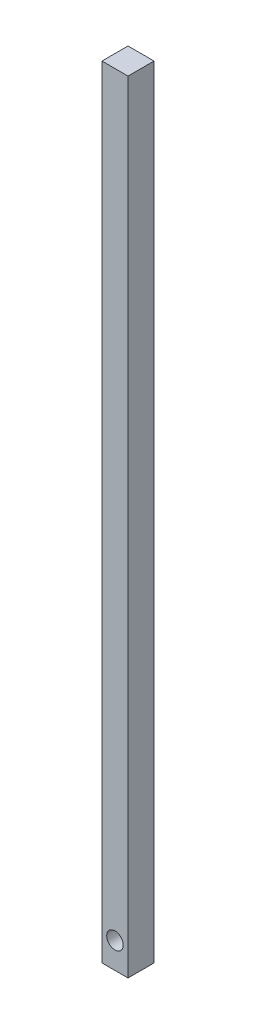
ISO-10303-21;
HEADER;
FILE_DESCRIPTION(('STEP AP214'),'2;1');
FILE_NAME('part.step','',(''),(''),'','','');
FILE_SCHEMA(('AUTOMOTIVE_DESIGN { 1 0 10303 214 1 1 1 1 }'));
ENDSEC;
DATA;
#1=APPLICATION_CONTEXT('core data for automotive mechanical design processes');
#2=APPLICATION_PROTOCOL_DEFINITION('international standard','automotive_design',2000,#1);
#3=PRODUCT_CONTEXT('',#1,'mechanical');
#4=PRODUCT('Part','Part','',(#3));
#5=PRODUCT_RELATED_PRODUCT_CATEGORY('part','',(#4));
#6=PRODUCT_DEFINITION_FORMATION('','',#4);
#7=PRODUCT_DEFINITION_CONTEXT('part definition',#1,'design');
#8=PRODUCT_DEFINITION('design','',#6,#7);
#9=PRODUCT_DEFINITION_SHAPE('','',#8);
#10=(LENGTH_UNIT() NAMED_UNIT(*) SI_UNIT(.MILLI.,.METRE.));
#11=(NAMED_UNIT(*) PLANE_ANGLE_UNIT() SI_UNIT($,.RADIAN.));
#12=(NAMED_UNIT(*) SI_UNIT($,.STERADIAN.) SOLID_ANGLE_UNIT());
#13=UNCERTAINTY_MEASURE_WITH_UNIT(LENGTH_MEASURE(1.E-05),#10,'distance_accuracy_value','');
#14=(GEOMETRIC_REPRESENTATION_CONTEXT(3) GLOBAL_UNCERTAINTY_ASSIGNED_CONTEXT((#13)) GLOBAL_UNIT_ASSIGNED_CONTEXT((#10,
#11,#12)) REPRESENTATION_CONTEXT('',''));
#15=CARTESIAN_POINT('',(0.,0.,0.));
#16=DIRECTION('',(0.,0.,1.));
#17=DIRECTION('',(1.,0.,0.));
#18=AXIS2_PLACEMENT_3D('',#15,#16,#17);
#19=CARTESIAN_POINT('',(0.,300.,0.));
#20=DIRECTION('',(1.,0.,0.));
#21=DIRECTION('',(0.,0.,-1.));
#22=AXIS2_PLACEMENT_3D('',#19,#20,#21);
#23=PLANE('',#22);
#24=DIRECTION('',(0.,0.,1.));
#25=VECTOR('',#24,1.);
#26=CARTESIAN_POINT('',(0.,0.,0.));
#27=LINE('',#26,#25);
#28=CARTESIAN_POINT('',(0.,0.,-10.));
#29=VERTEX_POINT('',#28);
#30=CARTESIAN_POINT('',(0.,0.,0.));
#31=VERTEX_POINT('',#30);
#32=EDGE_CURVE('E107',#29,#31,#27,.T.);
#33=ORIENTED_EDGE('',*,*,#32,.T.);
#34=DIRECTION('',(0.,-1.,0.));
#35=VECTOR('',#34,1.);
#36=CARTESIAN_POINT('',(0.,300.,0.));
#37=LINE('',#36,#35);
#38=CARTESIAN_POINT('',(0.,300.,0.));
#39=VERTEX_POINT('',#38);
#40=EDGE_CURVE('E11',#39,#31,#37,.T.);
#41=ORIENTED_EDGE('',*,*,#40,.F.);
#42=DIRECTION('',(0.,0.,1.));
#43=VECTOR('',#42,1.);
#44=CARTESIAN_POINT('',(0.,300.,0.));
#45=LINE('',#44,#43);
#46=CARTESIAN_POINT('',(0.,300.,-10.));
#47=VERTEX_POINT('',#46);
#48=EDGE_CURVE('E91',#47,#39,#45,.T.);
#49=ORIENTED_EDGE('',*,*,#48,.F.);
#50=DIRECTION('',(0.,-1.,0.));
#51=VECTOR('',#50,1.);
#52=CARTESIAN_POINT('',(0.,300.,-10.));
#53=LINE('',#52,#51);
#54=EDGE_CURVE('E103',#47,#29,#53,.T.);
#55=ORIENTED_EDGE('',*,*,#54,.T.);
#56=EDGE_LOOP('',(#33,#41,#49,#55));
#57=FACE_BOUND('',#56,.T.);
#58=ADVANCED_FACE('F39',(#57),#23,.F.);
#59=CARTESIAN_POINT('',(0.,300.,0.));
#60=DIRECTION('',(0.,0.,-1.));
#61=DIRECTION('',(-1.,0.,0.));
#62=AXIS2_PLACEMENT_3D('',#59,#60,#61);
#63=PLANE('',#62);
#64=CARTESIAN_POINT('',(5.,10.,0.));
#65=DIRECTION('',(0.,0.,1.));
#66=DIRECTION('',(1.,0.,0.));
#67=AXIS2_PLACEMENT_3D('',#64,#65,#66);
#68=CIRCLE('',#67,3.175);
#69=CARTESIAN_POINT('',(8.175,10.,0.));
#70=VERTEX_POINT('',#69);
#71=EDGE_CURVE('E128',#70,#70,#68,.T.);
#72=ORIENTED_EDGE('',*,*,#71,.F.);
#73=EDGE_LOOP('',(#72));
#74=FACE_BOUND('',#73,.T.);
#75=DIRECTION('',(1.,0.,0.));
#76=VECTOR('',#75,1.);
#77=CARTESIAN_POINT('',(0.,0.,0.));
#78=LINE('',#77,#76);
#79=CARTESIAN_POINT('',(10.,0.,0.));
#80=VERTEX_POINT('',#79);
#81=EDGE_CURVE('E96',#31,#80,#78,.T.);
#82=ORIENTED_EDGE('',*,*,#81,.T.);
#83=DIRECTION('',(0.,-1.,0.));
#84=VECTOR('',#83,1.);
#85=CARTESIAN_POINT('',(10.,300.,0.));
#86=LINE('',#85,#84);
#87=CARTESIAN_POINT('',(10.,300.,0.));
#88=VERTEX_POINT('',#87);
#89=EDGE_CURVE('E48',#88,#80,#86,.T.);
#90=ORIENTED_EDGE('',*,*,#89,.F.);
#91=DIRECTION('',(1.,0.,0.));
#92=VECTOR('',#91,1.);
#93=CARTESIAN_POINT('',(0.,300.,0.));
#94=LINE('',#93,#92);
#95=EDGE_CURVE('E86',#39,#88,#94,.T.);
#96=ORIENTED_EDGE('',*,*,#95,.F.);
#97=ORIENTED_EDGE('',*,*,#40,.T.);
#98=EDGE_LOOP('',(#82,#90,#96,#97));
#99=FACE_BOUND('',#98,.T.);
#100=ADVANCED_FACE('F95',(#74,#99),#63,.F.);
#101=CARTESIAN_POINT('',(10.,300.,0.));
#102=DIRECTION('',(-1.,0.,0.));
#103=DIRECTION('',(0.,0.,1.));
#104=AXIS2_PLACEMENT_3D('',#101,#102,#103);
#105=PLANE('',#104);
#106=DIRECTION('',(0.,0.,-1.));
#107=VECTOR('',#106,1.);
#108=CARTESIAN_POINT('',(10.,0.,0.));
#109=LINE('',#108,#107);
#110=CARTESIAN_POINT('',(10.,0.,-10.));
#111=VERTEX_POINT('',#110);
#112=EDGE_CURVE('E73',#80,#111,#109,.T.);
#113=ORIENTED_EDGE('',*,*,#112,.T.);
#114=DIRECTION('',(0.,-1.,0.));
#115=VECTOR('',#114,1.);
#116=CARTESIAN_POINT('',(10.,300.,-10.));
#117=LINE('',#116,#115);
#118=CARTESIAN_POINT('',(10.,300.,-10.));
#119=VERTEX_POINT('',#118);
#120=EDGE_CURVE('E98',#119,#111,#117,.T.);
#121=ORIENTED_EDGE('',*,*,#120,.F.);
#122=DIRECTION('',(0.,0.,-1.));
#123=VECTOR('',#122,1.);
#124=CARTESIAN_POINT('',(10.,300.,0.));
#125=LINE('',#124,#123);
#126=EDGE_CURVE('E89',#88,#119,#125,.T.);
#127=ORIENTED_EDGE('',*,*,#126,.F.);
#128=ORIENTED_EDGE('',*,*,#89,.T.);
#129=EDGE_LOOP('',(#113,#121,#127,#128));
#130=FACE_BOUND('',#129,.T.);
#131=ADVANCED_FACE('F99',(#130),#105,.F.);
#132=CARTESIAN_POINT('',(0.,300.,-10.));
#133=DIRECTION('',(0.,0.,1.));
#134=DIRECTION('',(1.,0.,0.));
#135=AXIS2_PLACEMENT_3D('',#132,#133,#134);
#136=PLANE('',#135);
#137=CARTESIAN_POINT('',(5.,10.,-10.));
#138=DIRECTION('',(0.,0.,1.));
#139=DIRECTION('',(1.,0.,0.));
#140=AXIS2_PLACEMENT_3D('',#137,#138,#139);
#141=CIRCLE('',#140,3.175);
#142=CARTESIAN_POINT('',(8.175,10.,-10.));
#143=VERTEX_POINT('',#142);
#144=EDGE_CURVE('E111',#143,#143,#141,.T.);
#145=ORIENTED_EDGE('',*,*,#144,.T.);
#146=EDGE_LOOP('',(#145));
#147=FACE_BOUND('',#146,.T.);
#148=DIRECTION('',(-1.,0.,0.));
#149=VECTOR('',#148,1.);
#150=CARTESIAN_POINT('',(0.,0.,-10.));
#151=LINE('',#150,#149);
#152=EDGE_CURVE('E79',#111,#29,#151,.T.);
#153=ORIENTED_EDGE('',*,*,#152,.T.);
#154=ORIENTED_EDGE('',*,*,#54,.F.);
#155=DIRECTION('',(-1.,0.,0.));
#156=VECTOR('',#155,1.);
#157=CARTESIAN_POINT('',(0.,300.,-10.));
#158=LINE('',#157,#156);
#159=EDGE_CURVE('E56',#119,#47,#158,.T.);
#160=ORIENTED_EDGE('',*,*,#159,.F.);
#161=ORIENTED_EDGE('',*,*,#120,.T.);
#162=EDGE_LOOP('',(#153,#154,#160,#161));
#163=FACE_BOUND('',#162,.T.);
#164=ADVANCED_FACE('F121',(#147,#163),#136,.F.);
#165=CARTESIAN_POINT('',(0.,300.,0.));
#166=DIRECTION('',(0.,-1.,0.));
#167=DIRECTION('',(0.,0.,-1.));
#168=AXIS2_PLACEMENT_3D('',#165,#166,#167);
#169=PLANE('',#168);
#170=ORIENTED_EDGE('',*,*,#48,.T.);
#171=ORIENTED_EDGE('',*,*,#95,.T.);
#172=ORIENTED_EDGE('',*,*,#126,.T.);
#173=ORIENTED_EDGE('',*,*,#159,.T.);
#174=EDGE_LOOP('',(#170,#171,#172,#173));
#175=FACE_BOUND('',#174,.T.);
#176=ADVANCED_FACE('F87',(#175),#169,.F.);
#177=CARTESIAN_POINT('',(0.,0.,0.));
#178=DIRECTION('',(0.,-1.,0.));
#179=DIRECTION('',(0.,0.,-1.));
#180=AXIS2_PLACEMENT_3D('',#177,#178,#179);
#181=PLANE('',#180);
#182=ORIENTED_EDGE('',*,*,#32,.F.);
#183=ORIENTED_EDGE('',*,*,#152,.F.);
#184=ORIENTED_EDGE('',*,*,#112,.F.);
#185=ORIENTED_EDGE('',*,*,#81,.F.);
#186=EDGE_LOOP('',(#182,#183,#184,#185));
#187=FACE_BOUND('',#186,.T.);
#188=ADVANCED_FACE('F124',(#187),#181,.T.);
#189=CARTESIAN_POINT('',(5.,10.,-10.));
#190=DIRECTION('',(0.,0.,1.));
#191=DIRECTION('',(1.,0.,0.));
#192=AXIS2_PLACEMENT_3D('',#189,#190,#191);
#193=CYLINDRICAL_SURFACE('',#192,3.175);
#194=ORIENTED_EDGE('',*,*,#144,.F.);
#195=EDGE_LOOP('',(#194));
#196=FACE_BOUND('',#195,.T.);
#197=ORIENTED_EDGE('',*,*,#71,.T.);
#198=EDGE_LOOP('',(#197));
#199=FACE_BOUND('',#198,.T.);
#200=ADVANCED_FACE('F137',(#196,#199),#193,.F.);
#201=CLOSED_SHELL('',(#58,#100,#131,#164,#176,#188,#200));
#202=MANIFOLD_SOLID_BREP('B2',#201);
#203=ADVANCED_BREP_SHAPE_REPRESENTATION('',(#18,#202),#14);
#204=SHAPE_DEFINITION_REPRESENTATION(#9,#203);
ENDSEC;
END-ISO-10303-21;
